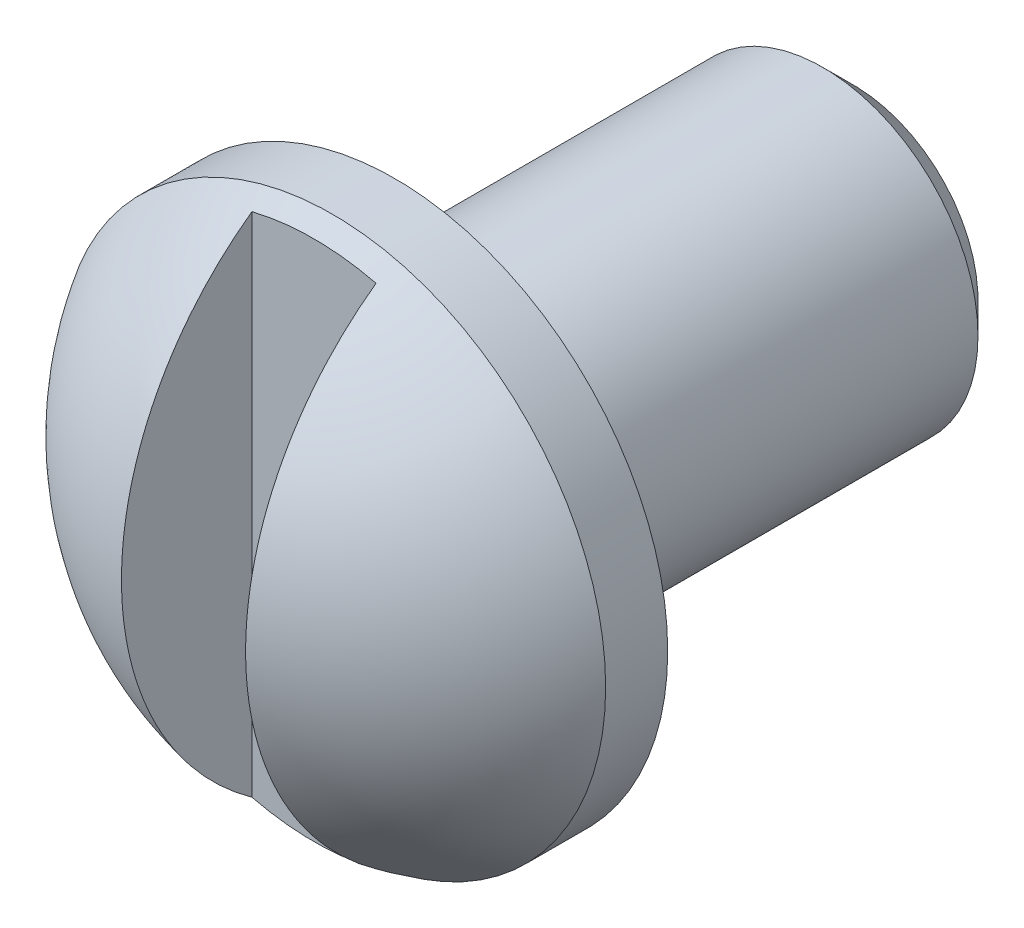
ISO-10303-21;
HEADER;
FILE_DESCRIPTION(('STEP AP214'),'2;1');
FILE_NAME('part.step','',(''),(''),'','','');
FILE_SCHEMA(('AUTOMOTIVE_DESIGN { 1 0 10303 214 1 1 1 1 }'));
ENDSEC;
DATA;
#1=APPLICATION_CONTEXT('core data for automotive mechanical design processes');
#2=APPLICATION_PROTOCOL_DEFINITION('international standard','automotive_design',2000,#1);
#3=PRODUCT_CONTEXT('',#1,'mechanical');
#4=PRODUCT('Part','Part','',(#3));
#5=PRODUCT_RELATED_PRODUCT_CATEGORY('part','',(#4));
#6=PRODUCT_DEFINITION_FORMATION('','',#4);
#7=PRODUCT_DEFINITION_CONTEXT('part definition',#1,'design');
#8=PRODUCT_DEFINITION('design','',#6,#7);
#9=PRODUCT_DEFINITION_SHAPE('','',#8);
#10=(LENGTH_UNIT() NAMED_UNIT(*) SI_UNIT(.MILLI.,.METRE.));
#11=(NAMED_UNIT(*) PLANE_ANGLE_UNIT() SI_UNIT($,.RADIAN.));
#12=(NAMED_UNIT(*) SI_UNIT($,.STERADIAN.) SOLID_ANGLE_UNIT());
#13=UNCERTAINTY_MEASURE_WITH_UNIT(LENGTH_MEASURE(1.E-05),#10,'distance_accuracy_value','');
#14=(GEOMETRIC_REPRESENTATION_CONTEXT(3) GLOBAL_UNCERTAINTY_ASSIGNED_CONTEXT((#13)) GLOBAL_UNIT_ASSIGNED_CONTEXT((#10,
#11,#12)) REPRESENTATION_CONTEXT('',''));
#15=CARTESIAN_POINT('',(0.,0.,0.));
#16=DIRECTION('',(0.,0.,1.));
#17=DIRECTION('',(1.,0.,0.));
#18=AXIS2_PLACEMENT_3D('',#15,#16,#17);
#19=CARTESIAN_POINT('',(0.,0.,-5.45));
#20=DIRECTION('',(0.,0.,1.));
#21=DIRECTION('',(1.,0.,0.));
#22=AXIS2_PLACEMENT_3D('',#19,#20,#21);
#23=CONICAL_SURFACE('',#22,1.,0.785398163397448);
#24=CARTESIAN_POINT('',(0.,0.,-5.45));
#25=DIRECTION('',(0.,0.,-1.));
#26=DIRECTION('',(-1.,0.,0.));
#27=AXIS2_PLACEMENT_3D('',#24,#25,#26);
#28=CIRCLE('',#27,1.);
#29=CARTESIAN_POINT('',(-1.,0.,-5.45));
#30=VERTEX_POINT('',#29);
#31=EDGE_CURVE('E64',#30,#30,#28,.T.);
#32=ORIENTED_EDGE('',*,*,#31,.F.);
#33=EDGE_LOOP('',(#32));
#34=FACE_BOUND('',#33,.T.);
#35=CARTESIAN_POINT('',(0.,0.,-5.2));
#36=DIRECTION('',(0.,0.,1.));
#37=DIRECTION('',(-1.,0.,0.));
#38=AXIS2_PLACEMENT_3D('',#35,#36,#37);
#39=CIRCLE('',#38,1.25);
#40=CARTESIAN_POINT('',(-1.25,0.,-5.2));
#41=VERTEX_POINT('',#40);
#42=EDGE_CURVE('E71',#41,#41,#39,.T.);
#43=ORIENTED_EDGE('',*,*,#42,.F.);
#44=EDGE_LOOP('',(#43));
#45=FACE_BOUND('',#44,.T.);
#46=ADVANCED_FACE('F16',(#34,#45),#23,.T.);
#47=CARTESIAN_POINT('',(-0.5,0.,-259.167621135332));
#48=DIRECTION('',(1.,0.,0.));
#49=DIRECTION('',(0.,1.,0.));
#50=AXIS2_PLACEMENT_3D('',#47,#48,#49);
#51=PLANE('',#50);
#52=CARTESIAN_POINT('',(-0.5,0.,-2.561));
#53=DIRECTION('',(1.,0.,0.));
#54=DIRECTION('',(0.,1.,0.));
#55=AXIS2_PLACEMENT_3D('',#52,#53,#54);
#56=CIRCLE('',#55,2.51171674358396);
#57=CARTESIAN_POINT('',(-0.5,2.04308590127775,-1.09999999999997));
#58=VERTEX_POINT('',#57);
#59=CARTESIAN_POINT('',(-0.5,-2.04308590127775,-1.09999999999997));
#60=VERTEX_POINT('',#59);
#61=EDGE_CURVE('E87',#58,#60,#56,.T.);
#62=ORIENTED_EDGE('',*,*,#61,.T.);
#63=DIRECTION('',(0.,1.,0.));
#64=VECTOR('',#63,1.);
#65=CARTESIAN_POINT('',(-0.5,0.,-1.09999999999997));
#66=LINE('',#65,#64);
#67=EDGE_CURVE('E26',#60,#58,#66,.T.);
#68=ORIENTED_EDGE('',*,*,#67,.T.);
#69=EDGE_LOOP('',(#62,#68));
#70=FACE_BOUND('',#69,.T.);
#71=ADVANCED_FACE('F108',(#70),#51,.T.);
#72=CARTESIAN_POINT('',(0.5,0.,-259.167621135332));
#73=DIRECTION('',(1.,0.,0.));
#74=DIRECTION('',(0.,1.,0.));
#75=AXIS2_PLACEMENT_3D('',#72,#73,#74);
#76=PLANE('',#75);
#77=DIRECTION('',(0.,1.,0.));
#78=VECTOR('',#77,1.);
#79=CARTESIAN_POINT('',(0.5,0.,-1.09999999999997));
#80=LINE('',#79,#78);
#81=CARTESIAN_POINT('',(0.5,-2.04308590127775,-1.09999999999997));
#82=VERTEX_POINT('',#81);
#83=CARTESIAN_POINT('',(0.5,2.04308590127775,-1.09999999999997));
#84=VERTEX_POINT('',#83);
#85=EDGE_CURVE('E11',#82,#84,#80,.T.);
#86=ORIENTED_EDGE('',*,*,#85,.F.);
#87=CARTESIAN_POINT('',(0.5,0.,-2.561));
#88=DIRECTION('',(1.,0.,0.));
#89=DIRECTION('',(0.,1.,0.));
#90=AXIS2_PLACEMENT_3D('',#87,#88,#89);
#91=CIRCLE('',#90,2.51171674358396);
#92=EDGE_CURVE('E94',#84,#82,#91,.T.);
#93=ORIENTED_EDGE('',*,*,#92,.F.);
#94=EDGE_LOOP('',(#86,#93));
#95=FACE_BOUND('',#94,.T.);
#96=ADVANCED_FACE('F148',(#95),#76,.F.);
#97=CARTESIAN_POINT('',(1.725,0.,-1.1));
#98=DIRECTION('',(0.,0.,-1.));
#99=DIRECTION('',(0.,-1.,0.));
#100=AXIS2_PLACEMENT_3D('',#97,#98,#99);
#101=PLANE('',#100);
#102=ORIENTED_EDGE('',*,*,#67,.F.);
#103=CARTESIAN_POINT('',(0.,0.,-1.1));
#104=DIRECTION('',(0.,0.,-1.));
#105=DIRECTION('',(-1.,0.,0.));
#106=AXIS2_PLACEMENT_3D('',#103,#104,#105);
#107=CIRCLE('',#106,2.10337823512558);
#108=EDGE_CURVE('E91',#82,#60,#107,.T.);
#109=ORIENTED_EDGE('',*,*,#108,.F.);
#110=ORIENTED_EDGE('',*,*,#85,.T.);
#111=CARTESIAN_POINT('',(0.,0.,-1.1));
#112=DIRECTION('',(0.,0.,-1.));
#113=DIRECTION('',(-1.,0.,0.));
#114=AXIS2_PLACEMENT_3D('',#111,#112,#113);
#115=CIRCLE('',#114,2.10337823512558);
#116=EDGE_CURVE('E118',#58,#84,#115,.T.);
#117=ORIENTED_EDGE('',*,*,#116,.F.);
#118=EDGE_LOOP('',(#102,#109,#110,#117));
#119=FACE_BOUND('',#118,.T.);
#120=ADVANCED_FACE('F117',(#119),#101,.F.);
#121=CARTESIAN_POINT('',(0.,0.,2.725));
#122=DIRECTION('',(0.,0.,-1.));
#123=DIRECTION('',(-1.,0.,0.));
#124=AXIS2_PLACEMENT_3D('',#121,#122,#123);
#125=CYLINDRICAL_SURFACE('',#124,2.2);
#126=CARTESIAN_POINT('',(0.,0.,-1.75));
#127=DIRECTION('',(0.,0.,-1.));
#128=DIRECTION('',(-1.,0.,0.));
#129=AXIS2_PLACEMENT_3D('',#126,#127,#128);
#130=CIRCLE('',#129,2.2);
#131=CARTESIAN_POINT('',(-2.2,0.,-1.75));
#132=VERTEX_POINT('',#131);
#133=EDGE_CURVE('E37',#132,#132,#130,.T.);
#134=ORIENTED_EDGE('',*,*,#133,.F.);
#135=EDGE_LOOP('',(#134));
#136=FACE_BOUND('',#135,.T.);
#137=CARTESIAN_POINT('',(0.,0.,-1.25));
#138=DIRECTION('',(0.,0.,-1.));
#139=DIRECTION('',(-1.,0.,0.));
#140=AXIS2_PLACEMENT_3D('',#137,#138,#139);
#141=CIRCLE('',#140,2.2);
#142=CARTESIAN_POINT('',(-2.2,0.,-1.25));
#143=VERTEX_POINT('',#142);
#144=EDGE_CURVE('E83',#143,#143,#141,.T.);
#145=ORIENTED_EDGE('',*,*,#144,.T.);
#146=EDGE_LOOP('',(#145));
#147=FACE_BOUND('',#146,.T.);
#148=ADVANCED_FACE('F180',(#136,#147),#125,.T.);
#149=CARTESIAN_POINT('',(1.725,0.,-1.75));
#150=DIRECTION('',(0.,0.,-1.));
#151=DIRECTION('',(0.,-1.,0.));
#152=AXIS2_PLACEMENT_3D('',#149,#150,#151);
#153=PLANE('',#152);
#154=CARTESIAN_POINT('',(0.,0.,-1.75));
#155=DIRECTION('',(0.,0.,-1.));
#156=DIRECTION('',(-1.,0.,0.));
#157=AXIS2_PLACEMENT_3D('',#154,#155,#156);
#158=CIRCLE('',#157,1.25);
#159=CARTESIAN_POINT('',(-1.25,0.,-1.75));
#160=VERTEX_POINT('',#159);
#161=EDGE_CURVE('E75',#160,#160,#158,.T.);
#162=ORIENTED_EDGE('',*,*,#161,.F.);
#163=EDGE_LOOP('',(#162));
#164=FACE_BOUND('',#163,.T.);
#165=ORIENTED_EDGE('',*,*,#133,.T.);
#166=EDGE_LOOP('',(#165));
#167=FACE_BOUND('',#166,.T.);
#168=ADVANCED_FACE('F170',(#164,#167),#153,.T.);
#169=CARTESIAN_POINT('',(0.,0.,2.725));
#170=DIRECTION('',(0.,0.,-1.));
#171=DIRECTION('',(-1.,0.,0.));
#172=AXIS2_PLACEMENT_3D('',#169,#170,#171);
#173=CYLINDRICAL_SURFACE('',#172,1.25);
#174=ORIENTED_EDGE('',*,*,#161,.T.);
#175=EDGE_LOOP('',(#174));
#176=FACE_BOUND('',#175,.T.);
#177=ORIENTED_EDGE('',*,*,#42,.T.);
#178=EDGE_LOOP('',(#177));
#179=FACE_BOUND('',#178,.T.);
#180=ADVANCED_FACE('F72',(#176,#179),#173,.T.);
#181=CARTESIAN_POINT('',(0.625,0.,-5.45));
#182=DIRECTION('',(0.,0.,-1.));
#183=DIRECTION('',(0.,-1.,0.));
#184=AXIS2_PLACEMENT_3D('',#181,#182,#183);
#185=PLANE('',#184);
#186=ORIENTED_EDGE('',*,*,#31,.T.);
#187=EDGE_LOOP('',(#186));
#188=FACE_BOUND('',#187,.T.);
#189=ADVANCED_FACE('F18',(#188),#185,.T.);
#190=CARTESIAN_POINT('',(0.,0.,-2.561));
#191=DIRECTION('',(0.,0.,-1.));
#192=DIRECTION('',(-1.,0.,0.));
#193=AXIS2_PLACEMENT_3D('',#190,#191,#192);
#194=SPHERICAL_SURFACE('',#193,2.561);
#195=ORIENTED_EDGE('',*,*,#144,.F.);
#196=EDGE_LOOP('',(#195));
#197=FACE_BOUND('',#196,.T.);
#198=ORIENTED_EDGE('',*,*,#116,.T.);
#199=ORIENTED_EDGE('',*,*,#92,.T.);
#200=ORIENTED_EDGE('',*,*,#108,.T.);
#201=ORIENTED_EDGE('',*,*,#61,.F.);
#202=EDGE_LOOP('',(#198,#199,#200,#201));
#203=FACE_BOUND('',#202,.T.);
#204=ADVANCED_FACE('F114',(#197,#203),#194,.T.);
#205=CLOSED_SHELL('',(#46,#71,#96,#120,#148,#168,#180,#189,#204));
#206=MANIFOLD_SOLID_BREP('B1',#205);
#207=ADVANCED_BREP_SHAPE_REPRESENTATION('',(#18,#206),#14);
#208=SHAPE_DEFINITION_REPRESENTATION(#9,#207);
ENDSEC;
END-ISO-10303-21;
